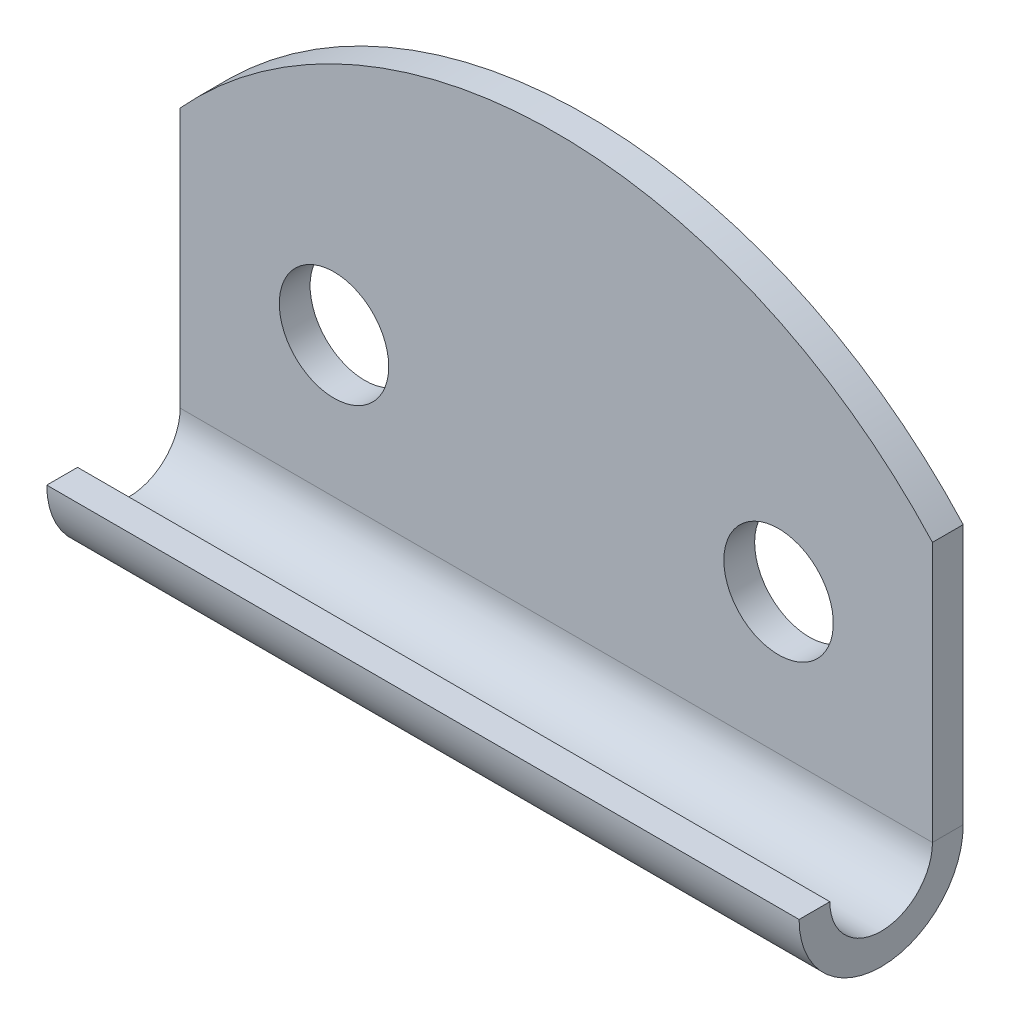
ISO-10303-21;
HEADER;
FILE_DESCRIPTION(('STEP AP214'),'2;1');
FILE_NAME('part.step','',(''),(''),'','','');
FILE_SCHEMA(('AUTOMOTIVE_DESIGN { 1 0 10303 214 1 1 1 1 }'));
ENDSEC;
DATA;
#1=APPLICATION_CONTEXT('core data for automotive mechanical design processes');
#2=APPLICATION_PROTOCOL_DEFINITION('international standard','automotive_design',2000,#1);
#3=PRODUCT_CONTEXT('',#1,'mechanical');
#4=PRODUCT('Part','Part','',(#3));
#5=PRODUCT_RELATED_PRODUCT_CATEGORY('part','',(#4));
#6=PRODUCT_DEFINITION_FORMATION('','',#4);
#7=PRODUCT_DEFINITION_CONTEXT('part definition',#1,'design');
#8=PRODUCT_DEFINITION('design','',#6,#7);
#9=PRODUCT_DEFINITION_SHAPE('','',#8);
#10=(LENGTH_UNIT() NAMED_UNIT(*) SI_UNIT(.MILLI.,.METRE.));
#11=(NAMED_UNIT(*) PLANE_ANGLE_UNIT() SI_UNIT($,.RADIAN.));
#12=(NAMED_UNIT(*) SI_UNIT($,.STERADIAN.) SOLID_ANGLE_UNIT());
#13=UNCERTAINTY_MEASURE_WITH_UNIT(LENGTH_MEASURE(1.E-05),#10,'distance_accuracy_value','');
#14=(GEOMETRIC_REPRESENTATION_CONTEXT(3) GLOBAL_UNCERTAINTY_ASSIGNED_CONTEXT((#13)) GLOBAL_UNIT_ASSIGNED_CONTEXT((#10,
#11,#12)) REPRESENTATION_CONTEXT('',''));
#15=CARTESIAN_POINT('',(0.,0.,0.));
#16=DIRECTION('',(0.,0.,1.));
#17=DIRECTION('',(1.,0.,0.));
#18=AXIS2_PLACEMENT_3D('',#15,#16,#17);
#19=CARTESIAN_POINT('',(11.,0.,-0.9));
#20=DIRECTION('',(1.,0.,0.));
#21=DIRECTION('',(0.,0.,-1.));
#22=AXIS2_PLACEMENT_3D('',#19,#20,#21);
#23=PLANE('',#22);
#24=DIRECTION('',(0.,1.,0.));
#25=VECTOR('',#24,1.);
#26=CARTESIAN_POINT('',(11.,0.,0.));
#27=LINE('',#26,#25);
#28=CARTESIAN_POINT('',(11.,2.4,0.));
#29=VERTEX_POINT('',#28);
#30=CARTESIAN_POINT('',(11.,10.,0.));
#31=VERTEX_POINT('',#30);
#32=EDGE_CURVE('E94',#29,#31,#27,.T.);
#33=ORIENTED_EDGE('',*,*,#32,.F.);
#34=DIRECTION('',(0.,0.,-1.));
#35=VECTOR('',#34,1.);
#36=CARTESIAN_POINT('',(11.,2.4,0.));
#37=LINE('',#36,#35);
#38=CARTESIAN_POINT('',(11.,2.39999999999999,-0.9));
#39=VERTEX_POINT('',#38);
#40=EDGE_CURVE('E120',#29,#39,#37,.T.);
#41=ORIENTED_EDGE('',*,*,#40,.T.);
#42=DIRECTION('',(0.,1.,0.));
#43=VECTOR('',#42,1.);
#44=CARTESIAN_POINT('',(11.,0.,-0.9));
#45=LINE('',#44,#43);
#46=CARTESIAN_POINT('',(11.,10.,-0.9));
#47=VERTEX_POINT('',#46);
#48=EDGE_CURVE('E102',#39,#47,#45,.T.);
#49=ORIENTED_EDGE('',*,*,#48,.T.);
#50=DIRECTION('',(0.,0.,1.));
#51=VECTOR('',#50,1.);
#52=CARTESIAN_POINT('',(11.,10.,-0.9));
#53=LINE('',#52,#51);
#54=EDGE_CURVE('E49',#47,#31,#53,.T.);
#55=ORIENTED_EDGE('',*,*,#54,.T.);
#56=EDGE_LOOP('',(#33,#41,#49,#55));
#57=FACE_BOUND('',#56,.T.);
#58=ADVANCED_FACE('F45',(#57),#23,.T.);
#59=CARTESIAN_POINT('',(-11.,0.,-0.9));
#60=DIRECTION('',(-1.,0.,0.));
#61=DIRECTION('',(0.,0.,1.));
#62=AXIS2_PLACEMENT_3D('',#59,#60,#61);
#63=PLANE('',#62);
#64=DIRECTION('',(0.,0.,-1.));
#65=VECTOR('',#64,1.);
#66=CARTESIAN_POINT('',(-11.,2.4,0.));
#67=LINE('',#66,#65);
#68=CARTESIAN_POINT('',(-11.,2.4,0.));
#69=VERTEX_POINT('',#68);
#70=CARTESIAN_POINT('',(-11.,2.39999999999999,-0.9));
#71=VERTEX_POINT('',#70);
#72=EDGE_CURVE('E91',#69,#71,#67,.T.);
#73=ORIENTED_EDGE('',*,*,#72,.F.);
#74=DIRECTION('',(0.,-1.,0.));
#75=VECTOR('',#74,1.);
#76=CARTESIAN_POINT('',(-11.,0.,0.));
#77=LINE('',#76,#75);
#78=CARTESIAN_POINT('',(-11.,10.,0.));
#79=VERTEX_POINT('',#78);
#80=EDGE_CURVE('E88',#79,#69,#77,.T.);
#81=ORIENTED_EDGE('',*,*,#80,.F.);
#82=DIRECTION('',(0.,0.,1.));
#83=VECTOR('',#82,1.);
#84=CARTESIAN_POINT('',(-11.,10.,-0.9));
#85=LINE('',#84,#83);
#86=CARTESIAN_POINT('',(-11.,10.,-0.9));
#87=VERTEX_POINT('',#86);
#88=EDGE_CURVE('E11',#87,#79,#85,.T.);
#89=ORIENTED_EDGE('',*,*,#88,.F.);
#90=DIRECTION('',(0.,-1.,0.));
#91=VECTOR('',#90,1.);
#92=CARTESIAN_POINT('',(-11.,0.,-0.9));
#93=LINE('',#92,#91);
#94=EDGE_CURVE('E100',#87,#71,#93,.T.);
#95=ORIENTED_EDGE('',*,*,#94,.T.);
#96=EDGE_LOOP('',(#73,#81,#89,#95));
#97=FACE_BOUND('',#96,.T.);
#98=ADVANCED_FACE('F47',(#97),#63,.T.);
#99=CARTESIAN_POINT('',(0.,0.,-0.9));
#100=DIRECTION('',(0.,0.,1.));
#101=DIRECTION('',(1.,0.,0.));
#102=AXIS2_PLACEMENT_3D('',#99,#100,#101);
#103=CYLINDRICAL_SURFACE('',#102,14.8660687473185);
#104=CARTESIAN_POINT('',(0.,0.,0.));
#105=DIRECTION('',(0.,0.,1.));
#106=DIRECTION('',(-1.,0.,0.));
#107=AXIS2_PLACEMENT_3D('',#104,#105,#106);
#108=CIRCLE('',#107,14.8660687473185);
#109=EDGE_CURVE('E83',#31,#79,#108,.T.);
#110=ORIENTED_EDGE('',*,*,#109,.F.);
#111=ORIENTED_EDGE('',*,*,#54,.F.);
#112=CARTESIAN_POINT('',(0.,0.,-0.9));
#113=DIRECTION('',(0.,0.,1.));
#114=DIRECTION('',(-1.,0.,0.));
#115=AXIS2_PLACEMENT_3D('',#112,#113,#114);
#116=CIRCLE('',#115,14.8660687473185);
#117=EDGE_CURVE('E85',#47,#87,#116,.T.);
#118=ORIENTED_EDGE('',*,*,#117,.T.);
#119=ORIENTED_EDGE('',*,*,#88,.T.);
#120=EDGE_LOOP('',(#110,#111,#118,#119));
#121=FACE_BOUND('',#120,.T.);
#122=ADVANCED_FACE('F80',(#121),#103,.T.);
#123=CARTESIAN_POINT('',(0.,0.,-0.9));
#124=DIRECTION('',(0.,0.,-1.));
#125=DIRECTION('',(-1.,0.,0.));
#126=AXIS2_PLACEMENT_3D('',#123,#124,#125);
#127=PLANE('',#126);
#128=DIRECTION('',(1.,0.,0.));
#129=VECTOR('',#128,1.);
#130=CARTESIAN_POINT('',(11.,2.39999999999999,-0.9));
#131=LINE('',#130,#129);
#132=EDGE_CURVE('E142',#39,#71,#131,.F.);
#133=ORIENTED_EDGE('',*,*,#132,.T.);
#134=ORIENTED_EDGE('',*,*,#94,.F.);
#135=ORIENTED_EDGE('',*,*,#117,.F.);
#136=ORIENTED_EDGE('',*,*,#48,.F.);
#137=EDGE_LOOP('',(#133,#134,#135,#136));
#138=FACE_BOUND('',#137,.T.);
#139=CARTESIAN_POINT('',(6.5,6.49999999999999,-0.9));
#140=DIRECTION('',(0.,0.,1.));
#141=DIRECTION('',(-1.,0.,0.));
#142=AXIS2_PLACEMENT_3D('',#139,#140,#141);
#143=CIRCLE('',#142,1.6);
#144=CARTESIAN_POINT('',(4.9,6.49999999999999,-0.9));
#145=VERTEX_POINT('',#144);
#146=EDGE_CURVE('E111',#145,#145,#143,.T.);
#147=ORIENTED_EDGE('',*,*,#146,.T.);
#148=EDGE_LOOP('',(#147));
#149=FACE_BOUND('',#148,.T.);
#150=CARTESIAN_POINT('',(-6.5,6.5,-0.9));
#151=DIRECTION('',(0.,0.,1.));
#152=DIRECTION('',(1.,0.,0.));
#153=AXIS2_PLACEMENT_3D('',#150,#151,#152);
#154=CIRCLE('',#153,1.6);
#155=CARTESIAN_POINT('',(-4.9,6.5,-0.9));
#156=VERTEX_POINT('',#155);
#157=EDGE_CURVE('E95',#156,#156,#154,.T.);
#158=ORIENTED_EDGE('',*,*,#157,.T.);
#159=EDGE_LOOP('',(#158));
#160=FACE_BOUND('',#159,.T.);
#161=ADVANCED_FACE('F151',(#138,#149,#160),#127,.T.);
#162=CARTESIAN_POINT('',(0.,0.,0.));
#163=DIRECTION('',(0.,0.,-1.));
#164=DIRECTION('',(-1.,0.,0.));
#165=AXIS2_PLACEMENT_3D('',#162,#163,#164);
#166=PLANE('',#165);
#167=CARTESIAN_POINT('',(6.5,6.49999999999999,0.));
#168=DIRECTION('',(0.,0.,1.));
#169=DIRECTION('',(-1.,0.,0.));
#170=AXIS2_PLACEMENT_3D('',#167,#168,#169);
#171=CIRCLE('',#170,1.6);
#172=CARTESIAN_POINT('',(4.9,6.49999999999999,0.));
#173=VERTEX_POINT('',#172);
#174=EDGE_CURVE('E114',#173,#173,#171,.T.);
#175=ORIENTED_EDGE('',*,*,#174,.F.);
#176=EDGE_LOOP('',(#175));
#177=FACE_BOUND('',#176,.T.);
#178=CARTESIAN_POINT('',(-6.5,6.5,0.));
#179=DIRECTION('',(0.,0.,1.));
#180=DIRECTION('',(1.,0.,0.));
#181=AXIS2_PLACEMENT_3D('',#178,#179,#180);
#182=CIRCLE('',#181,1.6);
#183=CARTESIAN_POINT('',(-4.9,6.5,0.));
#184=VERTEX_POINT('',#183);
#185=EDGE_CURVE('E108',#184,#184,#182,.T.);
#186=ORIENTED_EDGE('',*,*,#185,.F.);
#187=EDGE_LOOP('',(#186));
#188=FACE_BOUND('',#187,.T.);
#189=ORIENTED_EDGE('',*,*,#80,.T.);
#190=DIRECTION('',(1.,0.,0.));
#191=VECTOR('',#190,1.);
#192=CARTESIAN_POINT('',(11.,2.4,0.));
#193=LINE('',#192,#191);
#194=EDGE_CURVE('E133',#29,#69,#193,.F.);
#195=ORIENTED_EDGE('',*,*,#194,.F.);
#196=ORIENTED_EDGE('',*,*,#32,.T.);
#197=ORIENTED_EDGE('',*,*,#109,.T.);
#198=EDGE_LOOP('',(#189,#195,#196,#197));
#199=FACE_BOUND('',#198,.T.);
#200=ADVANCED_FACE('F97',(#177,#188,#199),#166,.F.);
#201=CARTESIAN_POINT('',(-6.5,6.5,-0.9));
#202=DIRECTION('',(0.,0.,1.));
#203=DIRECTION('',(1.,0.,0.));
#204=AXIS2_PLACEMENT_3D('',#201,#202,#203);
#205=CYLINDRICAL_SURFACE('',#204,1.6);
#206=ORIENTED_EDGE('',*,*,#157,.F.);
#207=EDGE_LOOP('',(#206));
#208=FACE_BOUND('',#207,.T.);
#209=ORIENTED_EDGE('',*,*,#185,.T.);
#210=EDGE_LOOP('',(#209));
#211=FACE_BOUND('',#210,.T.);
#212=ADVANCED_FACE('F176',(#208,#211),#205,.F.);
#213=CARTESIAN_POINT('',(6.5,6.49999999999999,-0.9));
#214=DIRECTION('',(0.,0.,1.));
#215=DIRECTION('',(1.,0.,0.));
#216=AXIS2_PLACEMENT_3D('',#213,#214,#215);
#217=CYLINDRICAL_SURFACE('',#216,1.6);
#218=ORIENTED_EDGE('',*,*,#146,.F.);
#219=EDGE_LOOP('',(#218));
#220=FACE_BOUND('',#219,.T.);
#221=ORIENTED_EDGE('',*,*,#174,.T.);
#222=EDGE_LOOP('',(#221));
#223=FACE_BOUND('',#222,.T.);
#224=ADVANCED_FACE('F182',(#220,#223),#217,.F.);
#225=CARTESIAN_POINT('',(0.,2.40000000000001,3.));
#226=DIRECTION('',(0.,-1.,0.));
#227=DIRECTION('',(1.,0.,0.));
#228=AXIS2_PLACEMENT_3D('',#225,#226,#227);
#229=PLANE('',#228);
#230=DIRECTION('',(0.,0.,1.));
#231=VECTOR('',#230,1.);
#232=CARTESIAN_POINT('',(11.,2.40000000000001,3.));
#233=LINE('',#232,#231);
#234=CARTESIAN_POINT('',(11.,2.40000000000001,3.));
#235=VERTEX_POINT('',#234);
#236=CARTESIAN_POINT('',(11.,2.40000000000002,3.9));
#237=VERTEX_POINT('',#236);
#238=EDGE_CURVE('E117',#235,#237,#233,.T.);
#239=ORIENTED_EDGE('',*,*,#238,.F.);
#240=DIRECTION('',(1.,0.,0.));
#241=VECTOR('',#240,1.);
#242=CARTESIAN_POINT('',(11.,2.40000000000001,3.));
#243=LINE('',#242,#241);
#244=CARTESIAN_POINT('',(-11.,2.40000000000001,3.));
#245=VERTEX_POINT('',#244);
#246=EDGE_CURVE('E130',#245,#235,#243,.T.);
#247=ORIENTED_EDGE('',*,*,#246,.F.);
#248=DIRECTION('',(0.,0.,1.));
#249=VECTOR('',#248,1.);
#250=CARTESIAN_POINT('',(-11.,2.40000000000001,3.));
#251=LINE('',#250,#249);
#252=CARTESIAN_POINT('',(-11.,2.40000000000002,3.9));
#253=VERTEX_POINT('',#252);
#254=EDGE_CURVE('E126',#245,#253,#251,.T.);
#255=ORIENTED_EDGE('',*,*,#254,.T.);
#256=DIRECTION('',(1.,0.,0.));
#257=VECTOR('',#256,1.);
#258=CARTESIAN_POINT('',(11.,2.40000000000002,3.9));
#259=LINE('',#258,#257);
#260=EDGE_CURVE('E138',#253,#237,#259,.T.);
#261=ORIENTED_EDGE('',*,*,#260,.T.);
#262=EDGE_LOOP('',(#239,#247,#255,#261));
#263=FACE_BOUND('',#262,.T.);
#264=ADVANCED_FACE('F185',(#263),#229,.F.);
#265=CARTESIAN_POINT('',(-11.,2.4,1.5));
#266=DIRECTION('',(-1.,0.,0.));
#267=DIRECTION('',(0.,0.,1.));
#268=AXIS2_PLACEMENT_3D('',#265,#266,#267);
#269=PLANE('',#268);
#270=ORIENTED_EDGE('',*,*,#254,.F.);
#271=CARTESIAN_POINT('',(-11.,2.4,1.5));
#272=DIRECTION('',(1.,0.,0.));
#273=DIRECTION('',(0.,0.,-1.));
#274=AXIS2_PLACEMENT_3D('',#271,#272,#273);
#275=CIRCLE('',#274,1.5);
#276=EDGE_CURVE('E135',#69,#245,#275,.F.);
#277=ORIENTED_EDGE('',*,*,#276,.F.);
#278=ORIENTED_EDGE('',*,*,#72,.T.);
#279=CARTESIAN_POINT('',(-11.,2.4,1.5));
#280=DIRECTION('',(1.,0.,0.));
#281=DIRECTION('',(0.,0.,-1.));
#282=AXIS2_PLACEMENT_3D('',#279,#280,#281);
#283=CIRCLE('',#282,2.4);
#284=EDGE_CURVE('E123',#71,#253,#283,.F.);
#285=ORIENTED_EDGE('',*,*,#284,.T.);
#286=EDGE_LOOP('',(#270,#277,#278,#285));
#287=FACE_BOUND('',#286,.T.);
#288=ADVANCED_FACE('F189',(#287),#269,.T.);
#289=CARTESIAN_POINT('',(11.,2.4,1.5));
#290=DIRECTION('',(-1.,0.,0.));
#291=DIRECTION('',(0.,0.,1.));
#292=AXIS2_PLACEMENT_3D('',#289,#290,#291);
#293=PLANE('',#292);
#294=CARTESIAN_POINT('',(11.,2.4,1.5));
#295=DIRECTION('',(1.,0.,0.));
#296=DIRECTION('',(0.,0.,-1.));
#297=AXIS2_PLACEMENT_3D('',#294,#295,#296);
#298=CIRCLE('',#297,1.5);
#299=EDGE_CURVE('E60',#235,#29,#298,.T.);
#300=ORIENTED_EDGE('',*,*,#299,.F.);
#301=ORIENTED_EDGE('',*,*,#238,.T.);
#302=CARTESIAN_POINT('',(11.,2.4,1.5));
#303=DIRECTION('',(1.,0.,0.));
#304=DIRECTION('',(0.,0.,-1.));
#305=AXIS2_PLACEMENT_3D('',#302,#303,#304);
#306=CIRCLE('',#305,2.4);
#307=EDGE_CURVE('E139',#237,#39,#306,.T.);
#308=ORIENTED_EDGE('',*,*,#307,.T.);
#309=ORIENTED_EDGE('',*,*,#40,.F.);
#310=EDGE_LOOP('',(#300,#301,#308,#309));
#311=FACE_BOUND('',#310,.T.);
#312=ADVANCED_FACE('F163',(#311),#293,.F.);
#313=CARTESIAN_POINT('',(11.,2.4,1.5));
#314=DIRECTION('',(1.,0.,0.));
#315=DIRECTION('',(0.,0.,1.));
#316=AXIS2_PLACEMENT_3D('',#313,#314,#315);
#317=CYLINDRICAL_SURFACE('',#316,2.4);
#318=ORIENTED_EDGE('',*,*,#132,.F.);
#319=ORIENTED_EDGE('',*,*,#307,.F.);
#320=ORIENTED_EDGE('',*,*,#260,.F.);
#321=ORIENTED_EDGE('',*,*,#284,.F.);
#322=EDGE_LOOP('',(#318,#319,#320,#321));
#323=FACE_BOUND('',#322,.T.);
#324=ADVANCED_FACE('F158',(#323),#317,.T.);
#325=CARTESIAN_POINT('',(11.,2.4,1.5));
#326=DIRECTION('',(1.,0.,0.));
#327=DIRECTION('',(0.,0.,1.));
#328=AXIS2_PLACEMENT_3D('',#325,#326,#327);
#329=CYLINDRICAL_SURFACE('',#328,1.5);
#330=ORIENTED_EDGE('',*,*,#194,.T.);
#331=ORIENTED_EDGE('',*,*,#276,.T.);
#332=ORIENTED_EDGE('',*,*,#246,.T.);
#333=ORIENTED_EDGE('',*,*,#299,.T.);
#334=EDGE_LOOP('',(#330,#331,#332,#333));
#335=FACE_BOUND('',#334,.T.);
#336=ADVANCED_FACE('F196',(#335),#329,.F.);
#337=CLOSED_SHELL('',(#58,#98,#122,#161,#200,#212,#224,#264,#288,#312,#324,#336));
#338=MANIFOLD_SOLID_BREP('B2',#337);
#339=ADVANCED_BREP_SHAPE_REPRESENTATION('',(#18,#338),#14);
#340=SHAPE_DEFINITION_REPRESENTATION(#9,#339);
ENDSEC;
END-ISO-10303-21;
